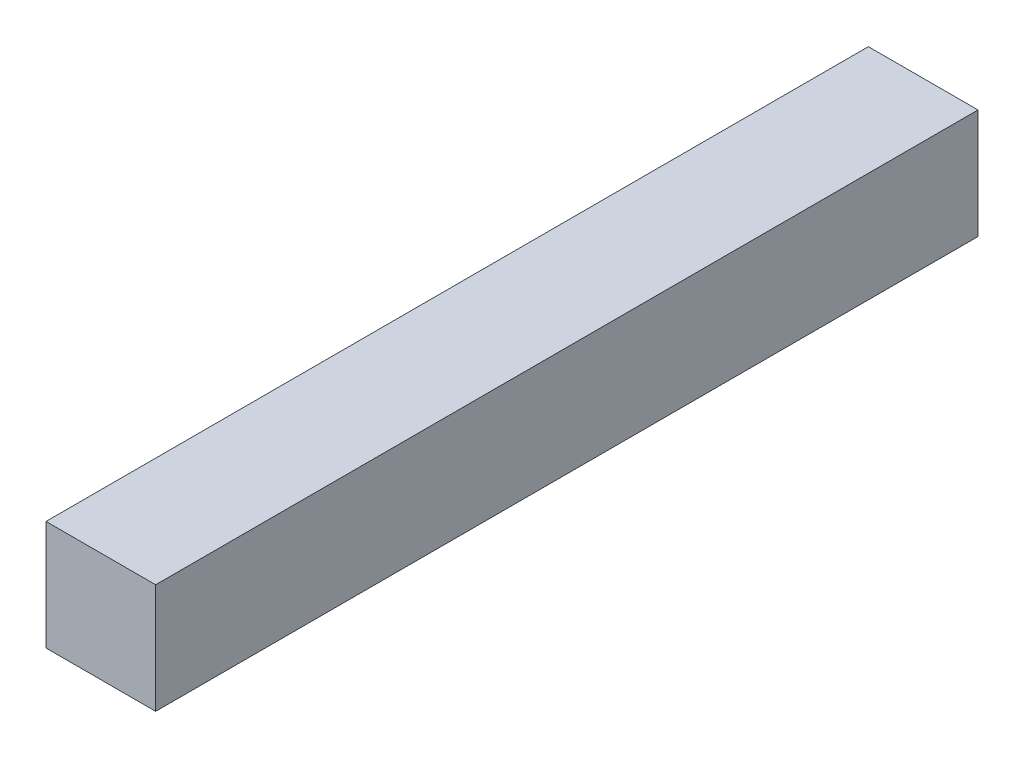
ISO-10303-21;
HEADER;
FILE_DESCRIPTION(('STEP AP214'),'2;1');
FILE_NAME('part.step','',(''),(''),'','','');
FILE_SCHEMA(('AUTOMOTIVE_DESIGN { 1 0 10303 214 1 1 1 1 }'));
ENDSEC;
DATA;
#1=APPLICATION_CONTEXT('core data for automotive mechanical design processes');
#2=APPLICATION_PROTOCOL_DEFINITION('international standard','automotive_design',2000,#1);
#3=PRODUCT_CONTEXT('',#1,'mechanical');
#4=PRODUCT('Part','Part','',(#3));
#5=PRODUCT_RELATED_PRODUCT_CATEGORY('part','',(#4));
#6=PRODUCT_DEFINITION_FORMATION('','',#4);
#7=PRODUCT_DEFINITION_CONTEXT('part definition',#1,'design');
#8=PRODUCT_DEFINITION('design','',#6,#7);
#9=PRODUCT_DEFINITION_SHAPE('','',#8);
#10=(LENGTH_UNIT() NAMED_UNIT(*) SI_UNIT(.MILLI.,.METRE.));
#11=(NAMED_UNIT(*) PLANE_ANGLE_UNIT() SI_UNIT($,.RADIAN.));
#12=(NAMED_UNIT(*) SI_UNIT($,.STERADIAN.) SOLID_ANGLE_UNIT());
#13=UNCERTAINTY_MEASURE_WITH_UNIT(LENGTH_MEASURE(1.E-05),#10,'distance_accuracy_value','');
#14=(GEOMETRIC_REPRESENTATION_CONTEXT(3) GLOBAL_UNCERTAINTY_ASSIGNED_CONTEXT((#13)) GLOBAL_UNIT_ASSIGNED_CONTEXT((#10,
#11,#12)) REPRESENTATION_CONTEXT('',''));
#15=CARTESIAN_POINT('',(0.,0.,0.));
#16=DIRECTION('',(0.,0.,1.));
#17=DIRECTION('',(1.,0.,0.));
#18=AXIS2_PLACEMENT_3D('',#15,#16,#17);
#19=CARTESIAN_POINT('',(10.,-10.,75.));
#20=DIRECTION('',(-1.,0.,0.));
#21=DIRECTION('',(0.,0.,1.));
#22=AXIS2_PLACEMENT_3D('',#19,#20,#21);
#23=PLANE('',#22);
#24=DIRECTION('',(0.,1.,0.));
#25=VECTOR('',#24,1.);
#26=CARTESIAN_POINT('',(10.,-10.,-75.));
#27=LINE('',#26,#25);
#28=CARTESIAN_POINT('',(10.,-10.,-75.));
#29=VERTEX_POINT('',#28);
#30=CARTESIAN_POINT('',(10.,10.,-75.));
#31=VERTEX_POINT('',#30);
#32=EDGE_CURVE('E96',#29,#31,#27,.T.);
#33=ORIENTED_EDGE('',*,*,#32,.T.);
#34=DIRECTION('',(0.,0.,-1.));
#35=VECTOR('',#34,1.);
#36=CARTESIAN_POINT('',(10.,10.,75.));
#37=LINE('',#36,#35);
#38=CARTESIAN_POINT('',(10.,10.,75.));
#39=VERTEX_POINT('',#38);
#40=EDGE_CURVE('E11',#39,#31,#37,.T.);
#41=ORIENTED_EDGE('',*,*,#40,.F.);
#42=DIRECTION('',(0.,1.,0.));
#43=VECTOR('',#42,1.);
#44=CARTESIAN_POINT('',(10.,-10.,75.));
#45=LINE('',#44,#43);
#46=CARTESIAN_POINT('',(10.,-10.,75.));
#47=VERTEX_POINT('',#46);
#48=EDGE_CURVE('E84',#47,#39,#45,.T.);
#49=ORIENTED_EDGE('',*,*,#48,.F.);
#50=DIRECTION('',(0.,0.,-1.));
#51=VECTOR('',#50,1.);
#52=CARTESIAN_POINT('',(10.,-10.,75.));
#53=LINE('',#52,#51);
#54=EDGE_CURVE('E92',#47,#29,#53,.T.);
#55=ORIENTED_EDGE('',*,*,#54,.T.);
#56=EDGE_LOOP('',(#33,#41,#49,#55));
#57=FACE_BOUND('',#56,.T.);
#58=ADVANCED_FACE('F33',(#57),#23,.F.);
#59=CARTESIAN_POINT('',(-9.99999999999999,10.,75.));
#60=DIRECTION('',(0.,-1.,0.));
#61=DIRECTION('',(0.,0.,-1.));
#62=AXIS2_PLACEMENT_3D('',#59,#60,#61);
#63=PLANE('',#62);
#64=DIRECTION('',(-1.,0.,0.));
#65=VECTOR('',#64,1.);
#66=CARTESIAN_POINT('',(-9.99999999999999,10.,-75.));
#67=LINE('',#66,#65);
#68=CARTESIAN_POINT('',(-9.99999999999999,10.,-75.));
#69=VERTEX_POINT('',#68);
#70=EDGE_CURVE('E88',#31,#69,#67,.T.);
#71=ORIENTED_EDGE('',*,*,#70,.T.);
#72=DIRECTION('',(0.,0.,-1.));
#73=VECTOR('',#72,1.);
#74=CARTESIAN_POINT('',(-9.99999999999999,10.,75.));
#75=LINE('',#74,#73);
#76=CARTESIAN_POINT('',(-9.99999999999999,10.,75.));
#77=VERTEX_POINT('',#76);
#78=EDGE_CURVE('E41',#77,#69,#75,.T.);
#79=ORIENTED_EDGE('',*,*,#78,.F.);
#80=DIRECTION('',(-1.,0.,0.));
#81=VECTOR('',#80,1.);
#82=CARTESIAN_POINT('',(-9.99999999999999,10.,75.));
#83=LINE('',#82,#81);
#84=EDGE_CURVE('E79',#39,#77,#83,.T.);
#85=ORIENTED_EDGE('',*,*,#84,.F.);
#86=ORIENTED_EDGE('',*,*,#40,.T.);
#87=EDGE_LOOP('',(#71,#79,#85,#86));
#88=FACE_BOUND('',#87,.T.);
#89=ADVANCED_FACE('F87',(#88),#63,.F.);
#90=CARTESIAN_POINT('',(-9.99999999999999,-10.,75.));
#91=DIRECTION('',(1.,0.,0.));
#92=DIRECTION('',(0.,0.,-1.));
#93=AXIS2_PLACEMENT_3D('',#90,#91,#92);
#94=PLANE('',#93);
#95=DIRECTION('',(0.,-1.,0.));
#96=VECTOR('',#95,1.);
#97=CARTESIAN_POINT('',(-9.99999999999999,-10.,-75.));
#98=LINE('',#97,#96);
#99=CARTESIAN_POINT('',(-9.99999999999999,-10.,-75.));
#100=VERTEX_POINT('',#99);
#101=EDGE_CURVE('E66',#69,#100,#98,.T.);
#102=ORIENTED_EDGE('',*,*,#101,.T.);
#103=DIRECTION('',(0.,0.,-1.));
#104=VECTOR('',#103,1.);
#105=CARTESIAN_POINT('',(-9.99999999999999,-10.,75.));
#106=LINE('',#105,#104);
#107=CARTESIAN_POINT('',(-9.99999999999999,-10.,75.));
#108=VERTEX_POINT('',#107);
#109=EDGE_CURVE('E89',#108,#100,#106,.T.);
#110=ORIENTED_EDGE('',*,*,#109,.F.);
#111=DIRECTION('',(0.,-1.,0.));
#112=VECTOR('',#111,1.);
#113=CARTESIAN_POINT('',(-9.99999999999999,-10.,75.));
#114=LINE('',#113,#112);
#115=EDGE_CURVE('E82',#77,#108,#114,.T.);
#116=ORIENTED_EDGE('',*,*,#115,.F.);
#117=ORIENTED_EDGE('',*,*,#78,.T.);
#118=EDGE_LOOP('',(#102,#110,#116,#117));
#119=FACE_BOUND('',#118,.T.);
#120=ADVANCED_FACE('F90',(#119),#94,.F.);
#121=CARTESIAN_POINT('',(-9.99999999999999,-10.,75.));
#122=DIRECTION('',(0.,1.,0.));
#123=DIRECTION('',(0.,0.,1.));
#124=AXIS2_PLACEMENT_3D('',#121,#122,#123);
#125=PLANE('',#124);
#126=DIRECTION('',(1.,0.,0.));
#127=VECTOR('',#126,1.);
#128=CARTESIAN_POINT('',(-9.99999999999999,-10.,-75.));
#129=LINE('',#128,#127);
#130=EDGE_CURVE('E72',#100,#29,#129,.T.);
#131=ORIENTED_EDGE('',*,*,#130,.T.);
#132=ORIENTED_EDGE('',*,*,#54,.F.);
#133=DIRECTION('',(1.,0.,0.));
#134=VECTOR('',#133,1.);
#135=CARTESIAN_POINT('',(-9.99999999999999,-10.,75.));
#136=LINE('',#135,#134);
#137=EDGE_CURVE('E49',#108,#47,#136,.T.);
#138=ORIENTED_EDGE('',*,*,#137,.F.);
#139=ORIENTED_EDGE('',*,*,#109,.T.);
#140=EDGE_LOOP('',(#131,#132,#138,#139));
#141=FACE_BOUND('',#140,.T.);
#142=ADVANCED_FACE('F104',(#141),#125,.F.);
#143=CARTESIAN_POINT('',(0.,0.,75.));
#144=DIRECTION('',(0.,0.,-1.));
#145=DIRECTION('',(-1.,0.,0.));
#146=AXIS2_PLACEMENT_3D('',#143,#144,#145);
#147=PLANE('',#146);
#148=ORIENTED_EDGE('',*,*,#48,.T.);
#149=ORIENTED_EDGE('',*,*,#84,.T.);
#150=ORIENTED_EDGE('',*,*,#115,.T.);
#151=ORIENTED_EDGE('',*,*,#137,.T.);
#152=EDGE_LOOP('',(#148,#149,#150,#151));
#153=FACE_BOUND('',#152,.T.);
#154=ADVANCED_FACE('F80',(#153),#147,.F.);
#155=CARTESIAN_POINT('',(0.,0.,-75.));
#156=DIRECTION('',(0.,0.,-1.));
#157=DIRECTION('',(-1.,0.,0.));
#158=AXIS2_PLACEMENT_3D('',#155,#156,#157);
#159=PLANE('',#158);
#160=CARTESIAN_POINT('',(0.,0.,-75.));
#161=DIRECTION('',(0.,0.,-1.));
#162=DIRECTION('',(-1.,0.,0.));
#163=AXIS2_PLACEMENT_3D('',#160,#161,#162);
#164=CIRCLE('',#163,2.5);
#165=CARTESIAN_POINT('',(-2.5,0.,-75.));
#166=VERTEX_POINT('',#165);
#167=EDGE_CURVE('E110',#166,#166,#164,.T.);
#168=ORIENTED_EDGE('',*,*,#167,.F.);
#169=EDGE_LOOP('',(#168));
#170=FACE_BOUND('',#169,.T.);
#171=ORIENTED_EDGE('',*,*,#32,.F.);
#172=ORIENTED_EDGE('',*,*,#130,.F.);
#173=ORIENTED_EDGE('',*,*,#101,.F.);
#174=ORIENTED_EDGE('',*,*,#70,.F.);
#175=EDGE_LOOP('',(#171,#172,#173,#174));
#176=FACE_BOUND('',#175,.T.);
#177=ADVANCED_FACE('F107',(#170,#176),#159,.T.);
#178=CARTESIAN_POINT('',(0.,0.,-65.));
#179=DIRECTION('',(0.,0.,-1.));
#180=DIRECTION('',(-1.,0.,0.));
#181=AXIS2_PLACEMENT_3D('',#178,#179,#180);
#182=CYLINDRICAL_SURFACE('',#181,2.5);
#183=CARTESIAN_POINT('',(0.,0.,-65.));
#184=DIRECTION('',(0.,0.,-1.));
#185=DIRECTION('',(-1.,0.,0.));
#186=AXIS2_PLACEMENT_3D('',#183,#184,#185);
#187=CIRCLE('',#186,2.5);
#188=CARTESIAN_POINT('',(-2.5,0.,-65.));
#189=VERTEX_POINT('',#188);
#190=EDGE_CURVE('E99',#189,#189,#187,.T.);
#191=ORIENTED_EDGE('',*,*,#190,.F.);
#192=EDGE_LOOP('',(#191));
#193=FACE_BOUND('',#192,.T.);
#194=ORIENTED_EDGE('',*,*,#167,.T.);
#195=EDGE_LOOP('',(#194));
#196=FACE_BOUND('',#195,.T.);
#197=ADVANCED_FACE('F118',(#193,#196),#182,.F.);
#198=CARTESIAN_POINT('',(0.,0.,-65.));
#199=DIRECTION('',(0.,0.,-1.));
#200=DIRECTION('',(-1.,0.,0.));
#201=AXIS2_PLACEMENT_3D('',#198,#199,#200);
#202=PLANE('',#201);
#203=ORIENTED_EDGE('',*,*,#190,.T.);
#204=EDGE_LOOP('',(#203));
#205=FACE_BOUND('',#204,.T.);
#206=ADVANCED_FACE('F116',(#205),#202,.T.);
#207=CLOSED_SHELL('',(#58,#89,#120,#142,#154,#177,#197,#206));
#208=MANIFOLD_SOLID_BREP('B2',#207);
#209=ADVANCED_BREP_SHAPE_REPRESENTATION('',(#18,#208),#14);
#210=SHAPE_DEFINITION_REPRESENTATION(#9,#209);
ENDSEC;
END-ISO-10303-21;
